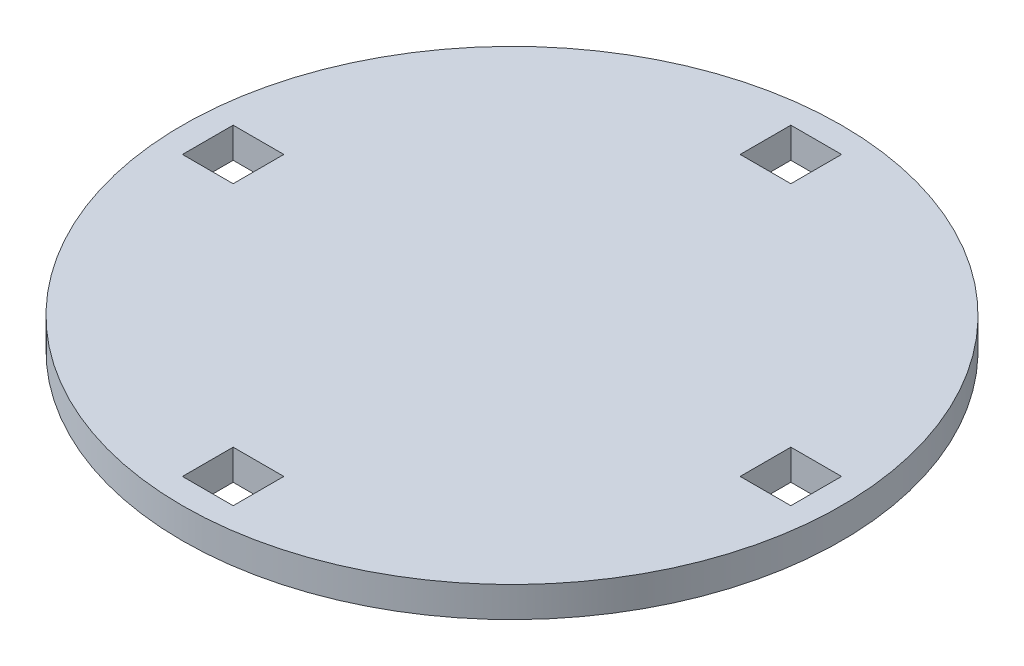
ISO-10303-21;
HEADER;
FILE_DESCRIPTION(('STEP AP214'),'2;1');
FILE_NAME('part.step','',(''),(''),'','','');
FILE_SCHEMA(('AUTOMOTIVE_DESIGN { 1 0 10303 214 1 1 1 1 }'));
ENDSEC;
DATA;
#1=APPLICATION_CONTEXT('core data for automotive mechanical design processes');
#2=APPLICATION_PROTOCOL_DEFINITION('international standard','automotive_design',2000,#1);
#3=PRODUCT_CONTEXT('',#1,'mechanical');
#4=PRODUCT('Part','Part','',(#3));
#5=PRODUCT_RELATED_PRODUCT_CATEGORY('part','',(#4));
#6=PRODUCT_DEFINITION_FORMATION('','',#4);
#7=PRODUCT_DEFINITION_CONTEXT('part definition',#1,'design');
#8=PRODUCT_DEFINITION('design','',#6,#7);
#9=PRODUCT_DEFINITION_SHAPE('','',#8);
#10=(LENGTH_UNIT() NAMED_UNIT(*) SI_UNIT(.MILLI.,.METRE.));
#11=(NAMED_UNIT(*) PLANE_ANGLE_UNIT() SI_UNIT($,.RADIAN.));
#12=(NAMED_UNIT(*) SI_UNIT($,.STERADIAN.) SOLID_ANGLE_UNIT());
#13=UNCERTAINTY_MEASURE_WITH_UNIT(LENGTH_MEASURE(1.E-05),#10,'distance_accuracy_value','');
#14=(GEOMETRIC_REPRESENTATION_CONTEXT(3) GLOBAL_UNCERTAINTY_ASSIGNED_CONTEXT((#13)) GLOBAL_UNIT_ASSIGNED_CONTEXT((#10,
#11,#12)) REPRESENTATION_CONTEXT('',''));
#15=CARTESIAN_POINT('',(0.,0.,0.));
#16=DIRECTION('',(0.,0.,1.));
#17=DIRECTION('',(1.,0.,0.));
#18=AXIS2_PLACEMENT_3D('',#15,#16,#17);
#19=CARTESIAN_POINT('',(0.,3.,0.));
#20=DIRECTION('',(0.,-1.,0.));
#21=DIRECTION('',(0.,0.,-1.));
#22=AXIS2_PLACEMENT_3D('',#19,#20,#21);
#23=CYLINDRICAL_SURFACE('',#22,32.5);
#24=CARTESIAN_POINT('',(0.,3.,0.));
#25=DIRECTION('',(0.,1.,0.));
#26=DIRECTION('',(0.,0.,1.));
#27=AXIS2_PLACEMENT_3D('',#24,#25,#26);
#28=CIRCLE('',#27,32.5);
#29=CARTESIAN_POINT('',(0.,3.,32.5));
#30=VERTEX_POINT('',#29);
#31=EDGE_CURVE('E220',#30,#30,#28,.T.);
#32=ORIENTED_EDGE('',*,*,#31,.F.);
#33=EDGE_LOOP('',(#32));
#34=FACE_BOUND('',#33,.T.);
#35=CARTESIAN_POINT('',(0.,0.,0.));
#36=DIRECTION('',(0.,1.,0.));
#37=DIRECTION('',(0.,0.,1.));
#38=AXIS2_PLACEMENT_3D('',#35,#36,#37);
#39=CIRCLE('',#38,32.5);
#40=CARTESIAN_POINT('',(0.,0.,32.5));
#41=VERTEX_POINT('',#40);
#42=EDGE_CURVE('E219',#41,#41,#39,.T.);
#43=ORIENTED_EDGE('',*,*,#42,.T.);
#44=EDGE_LOOP('',(#43));
#45=FACE_BOUND('',#44,.T.);
#46=ADVANCED_FACE('F50',(#34,#45),#23,.T.);
#47=CARTESIAN_POINT('',(0.,3.,0.));
#48=DIRECTION('',(0.,1.,0.));
#49=DIRECTION('',(0.,0.,1.));
#50=AXIS2_PLACEMENT_3D('',#47,#48,#49);
#51=PLANE('',#50);
#52=DIRECTION('',(0.,0.,-1.));
#53=VECTOR('',#52,1.);
#54=CARTESIAN_POINT('',(30.,3.,0.));
#55=LINE('',#54,#53);
#56=CARTESIAN_POINT('',(30.,3.,2.5));
#57=VERTEX_POINT('',#56);
#58=CARTESIAN_POINT('',(30.,3.,-2.5));
#59=VERTEX_POINT('',#58);
#60=EDGE_CURVE('E217',#57,#59,#55,.T.);
#61=ORIENTED_EDGE('',*,*,#60,.F.);
#62=DIRECTION('',(1.,0.,0.));
#63=VECTOR('',#62,1.);
#64=CARTESIAN_POINT('',(0.,3.,2.5));
#65=LINE('',#64,#63);
#66=CARTESIAN_POINT('',(25.,3.,2.5));
#67=VERTEX_POINT('',#66);
#68=EDGE_CURVE('E215',#67,#57,#65,.T.);
#69=ORIENTED_EDGE('',*,*,#68,.F.);
#70=DIRECTION('',(0.,0.,1.));
#71=VECTOR('',#70,1.);
#72=CARTESIAN_POINT('',(25.,3.,0.));
#73=LINE('',#72,#71);
#74=CARTESIAN_POINT('',(25.,3.,-2.5));
#75=VERTEX_POINT('',#74);
#76=EDGE_CURVE('E213',#75,#67,#73,.T.);
#77=ORIENTED_EDGE('',*,*,#76,.F.);
#78=DIRECTION('',(-1.,0.,0.));
#79=VECTOR('',#78,1.);
#80=CARTESIAN_POINT('',(0.,3.,-2.5));
#81=LINE('',#80,#79);
#82=EDGE_CURVE('E211',#59,#75,#81,.T.);
#83=ORIENTED_EDGE('',*,*,#82,.F.);
#84=EDGE_LOOP('',(#61,#69,#77,#83));
#85=FACE_BOUND('',#84,.T.);
#86=DIRECTION('',(0.,0.,1.));
#87=VECTOR('',#86,1.);
#88=CARTESIAN_POINT('',(-2.5,3.,0.));
#89=LINE('',#88,#87);
#90=CARTESIAN_POINT('',(-2.5,3.,25.));
#91=VERTEX_POINT('',#90);
#92=CARTESIAN_POINT('',(-2.5,3.,30.));
#93=VERTEX_POINT('',#92);
#94=EDGE_CURVE('E209',#91,#93,#89,.T.);
#95=ORIENTED_EDGE('',*,*,#94,.F.);
#96=DIRECTION('',(-1.,0.,0.));
#97=VECTOR('',#96,1.);
#98=CARTESIAN_POINT('',(0.,3.,25.));
#99=LINE('',#98,#97);
#100=CARTESIAN_POINT('',(2.5,3.,25.));
#101=VERTEX_POINT('',#100);
#102=EDGE_CURVE('E207',#101,#91,#99,.T.);
#103=ORIENTED_EDGE('',*,*,#102,.F.);
#104=DIRECTION('',(0.,0.,-1.));
#105=VECTOR('',#104,1.);
#106=CARTESIAN_POINT('',(2.5,3.,0.));
#107=LINE('',#106,#105);
#108=CARTESIAN_POINT('',(2.5,3.,30.));
#109=VERTEX_POINT('',#108);
#110=EDGE_CURVE('E205',#109,#101,#107,.T.);
#111=ORIENTED_EDGE('',*,*,#110,.F.);
#112=DIRECTION('',(1.,0.,0.));
#113=VECTOR('',#112,1.);
#114=CARTESIAN_POINT('',(0.,3.,30.));
#115=LINE('',#114,#113);
#116=EDGE_CURVE('E203',#93,#109,#115,.T.);
#117=ORIENTED_EDGE('',*,*,#116,.F.);
#118=EDGE_LOOP('',(#95,#103,#111,#117));
#119=FACE_BOUND('',#118,.T.);
#120=DIRECTION('',(-1.,0.,0.));
#121=VECTOR('',#120,1.);
#122=CARTESIAN_POINT('',(0.,3.,-2.5));
#123=LINE('',#122,#121);
#124=CARTESIAN_POINT('',(-25.,3.,-2.5));
#125=VERTEX_POINT('',#124);
#126=CARTESIAN_POINT('',(-30.,3.,-2.49999999999999));
#127=VERTEX_POINT('',#126);
#128=EDGE_CURVE('E200',#125,#127,#123,.T.);
#129=ORIENTED_EDGE('',*,*,#128,.F.);
#130=DIRECTION('',(0.,0.,-1.));
#131=VECTOR('',#130,1.);
#132=CARTESIAN_POINT('',(-25.,3.,0.));
#133=LINE('',#132,#131);
#134=CARTESIAN_POINT('',(-25.,3.,2.5));
#135=VERTEX_POINT('',#134);
#136=EDGE_CURVE('E198',#135,#125,#133,.T.);
#137=ORIENTED_EDGE('',*,*,#136,.F.);
#138=DIRECTION('',(1.,0.,0.));
#139=VECTOR('',#138,1.);
#140=CARTESIAN_POINT('',(0.,3.,2.5));
#141=LINE('',#140,#139);
#142=CARTESIAN_POINT('',(-30.,3.,2.50000000000001));
#143=VERTEX_POINT('',#142);
#144=EDGE_CURVE('E196',#143,#135,#141,.T.);
#145=ORIENTED_EDGE('',*,*,#144,.F.);
#146=DIRECTION('',(0.,0.,1.));
#147=VECTOR('',#146,1.);
#148=CARTESIAN_POINT('',(-30.,3.,0.));
#149=LINE('',#148,#147);
#150=EDGE_CURVE('E194',#127,#143,#149,.T.);
#151=ORIENTED_EDGE('',*,*,#150,.F.);
#152=EDGE_LOOP('',(#129,#137,#145,#151));
#153=FACE_BOUND('',#152,.T.);
#154=DIRECTION('',(0.,0.,-1.));
#155=VECTOR('',#154,1.);
#156=CARTESIAN_POINT('',(2.5,3.,0.));
#157=LINE('',#156,#155);
#158=CARTESIAN_POINT('',(2.49999999999999,3.,-25.));
#159=VERTEX_POINT('',#158);
#160=CARTESIAN_POINT('',(2.49999999999999,3.,-30.));
#161=VERTEX_POINT('',#160);
#162=EDGE_CURVE('E189',#159,#161,#157,.T.);
#163=ORIENTED_EDGE('',*,*,#162,.F.);
#164=DIRECTION('',(1.,0.,0.));
#165=VECTOR('',#164,1.);
#166=CARTESIAN_POINT('',(0.,3.,-25.));
#167=LINE('',#166,#165);
#168=CARTESIAN_POINT('',(-2.50000000000001,3.,-25.));
#169=VERTEX_POINT('',#168);
#170=EDGE_CURVE('E187',#169,#159,#167,.T.);
#171=ORIENTED_EDGE('',*,*,#170,.F.);
#172=DIRECTION('',(0.,0.,1.));
#173=VECTOR('',#172,1.);
#174=CARTESIAN_POINT('',(-2.5,3.,0.));
#175=LINE('',#174,#173);
#176=CARTESIAN_POINT('',(-2.50000000000001,3.,-30.));
#177=VERTEX_POINT('',#176);
#178=EDGE_CURVE('E172',#177,#169,#175,.T.);
#179=ORIENTED_EDGE('',*,*,#178,.F.);
#180=DIRECTION('',(-1.,0.,0.));
#181=VECTOR('',#180,1.);
#182=CARTESIAN_POINT('',(0.,3.,-30.));
#183=LINE('',#182,#181);
#184=EDGE_CURVE('E161',#161,#177,#183,.T.);
#185=ORIENTED_EDGE('',*,*,#184,.F.);
#186=EDGE_LOOP('',(#163,#171,#179,#185));
#187=FACE_BOUND('',#186,.T.);
#188=ORIENTED_EDGE('',*,*,#31,.T.);
#189=EDGE_LOOP('',(#188));
#190=FACE_BOUND('',#189,.T.);
#191=ADVANCED_FACE('F185',(#85,#119,#153,#187,#190),#51,.T.);
#192=CARTESIAN_POINT('',(0.,0.,0.));
#193=DIRECTION('',(0.,1.,0.));
#194=DIRECTION('',(0.,0.,1.));
#195=AXIS2_PLACEMENT_3D('',#192,#193,#194);
#196=PLANE('',#195);
#197=DIRECTION('',(1.,0.,0.));
#198=VECTOR('',#197,1.);
#199=CARTESIAN_POINT('',(0.,0.,2.5));
#200=LINE('',#199,#198);
#201=CARTESIAN_POINT('',(25.,0.,2.5));
#202=VERTEX_POINT('',#201);
#203=CARTESIAN_POINT('',(30.,0.,2.5));
#204=VERTEX_POINT('',#203);
#205=EDGE_CURVE('E57',#202,#204,#200,.T.);
#206=ORIENTED_EDGE('',*,*,#205,.T.);
#207=DIRECTION('',(0.,0.,-1.));
#208=VECTOR('',#207,1.);
#209=CARTESIAN_POINT('',(30.,0.,0.));
#210=LINE('',#209,#208);
#211=CARTESIAN_POINT('',(30.,0.,-2.5));
#212=VERTEX_POINT('',#211);
#213=EDGE_CURVE('E13',#204,#212,#210,.T.);
#214=ORIENTED_EDGE('',*,*,#213,.T.);
#215=DIRECTION('',(-1.,0.,0.));
#216=VECTOR('',#215,1.);
#217=CARTESIAN_POINT('',(0.,0.,-2.5));
#218=LINE('',#217,#216);
#219=CARTESIAN_POINT('',(25.,0.,-2.5));
#220=VERTEX_POINT('',#219);
#221=EDGE_CURVE('E258',#212,#220,#218,.T.);
#222=ORIENTED_EDGE('',*,*,#221,.T.);
#223=DIRECTION('',(0.,0.,1.));
#224=VECTOR('',#223,1.);
#225=CARTESIAN_POINT('',(25.,0.,0.));
#226=LINE('',#225,#224);
#227=EDGE_CURVE('E261',#220,#202,#226,.T.);
#228=ORIENTED_EDGE('',*,*,#227,.T.);
#229=EDGE_LOOP('',(#206,#214,#222,#228));
#230=FACE_BOUND('',#229,.T.);
#231=DIRECTION('',(-1.,0.,0.));
#232=VECTOR('',#231,1.);
#233=CARTESIAN_POINT('',(0.,0.,25.));
#234=LINE('',#233,#232);
#235=CARTESIAN_POINT('',(2.5,0.,25.));
#236=VERTEX_POINT('',#235);
#237=CARTESIAN_POINT('',(-2.5,0.,25.));
#238=VERTEX_POINT('',#237);
#239=EDGE_CURVE('E252',#236,#238,#234,.T.);
#240=ORIENTED_EDGE('',*,*,#239,.T.);
#241=DIRECTION('',(0.,0.,1.));
#242=VECTOR('',#241,1.);
#243=CARTESIAN_POINT('',(-2.5,0.,0.));
#244=LINE('',#243,#242);
#245=CARTESIAN_POINT('',(-2.5,0.,30.));
#246=VERTEX_POINT('',#245);
#247=EDGE_CURVE('E255',#238,#246,#244,.T.);
#248=ORIENTED_EDGE('',*,*,#247,.T.);
#249=DIRECTION('',(1.,0.,0.));
#250=VECTOR('',#249,1.);
#251=CARTESIAN_POINT('',(0.,0.,30.));
#252=LINE('',#251,#250);
#253=CARTESIAN_POINT('',(2.5,0.,30.));
#254=VERTEX_POINT('',#253);
#255=EDGE_CURVE('E246',#246,#254,#252,.T.);
#256=ORIENTED_EDGE('',*,*,#255,.T.);
#257=DIRECTION('',(0.,0.,-1.));
#258=VECTOR('',#257,1.);
#259=CARTESIAN_POINT('',(2.5,0.,0.));
#260=LINE('',#259,#258);
#261=EDGE_CURVE('E249',#254,#236,#260,.T.);
#262=ORIENTED_EDGE('',*,*,#261,.T.);
#263=EDGE_LOOP('',(#240,#248,#256,#262));
#264=FACE_BOUND('',#263,.T.);
#265=DIRECTION('',(0.,0.,-1.));
#266=VECTOR('',#265,1.);
#267=CARTESIAN_POINT('',(-25.,0.,0.));
#268=LINE('',#267,#266);
#269=CARTESIAN_POINT('',(-25.,0.,2.5));
#270=VERTEX_POINT('',#269);
#271=CARTESIAN_POINT('',(-25.,0.,-2.5));
#272=VERTEX_POINT('',#271);
#273=EDGE_CURVE('E240',#270,#272,#268,.T.);
#274=ORIENTED_EDGE('',*,*,#273,.T.);
#275=DIRECTION('',(-1.,0.,0.));
#276=VECTOR('',#275,1.);
#277=CARTESIAN_POINT('',(0.,0.,-2.5));
#278=LINE('',#277,#276);
#279=CARTESIAN_POINT('',(-30.,0.,-2.49999999999999));
#280=VERTEX_POINT('',#279);
#281=EDGE_CURVE('E243',#272,#280,#278,.T.);
#282=ORIENTED_EDGE('',*,*,#281,.T.);
#283=DIRECTION('',(0.,0.,1.));
#284=VECTOR('',#283,1.);
#285=CARTESIAN_POINT('',(-30.,0.,0.));
#286=LINE('',#285,#284);
#287=CARTESIAN_POINT('',(-30.,0.,2.50000000000001));
#288=VERTEX_POINT('',#287);
#289=EDGE_CURVE('E234',#280,#288,#286,.T.);
#290=ORIENTED_EDGE('',*,*,#289,.T.);
#291=DIRECTION('',(1.,0.,0.));
#292=VECTOR('',#291,1.);
#293=CARTESIAN_POINT('',(0.,0.,2.5));
#294=LINE('',#293,#292);
#295=EDGE_CURVE('E237',#288,#270,#294,.T.);
#296=ORIENTED_EDGE('',*,*,#295,.T.);
#297=EDGE_LOOP('',(#274,#282,#290,#296));
#298=FACE_BOUND('',#297,.T.);
#299=DIRECTION('',(1.,0.,0.));
#300=VECTOR('',#299,1.);
#301=CARTESIAN_POINT('',(0.,0.,-25.));
#302=LINE('',#301,#300);
#303=CARTESIAN_POINT('',(-2.50000000000001,0.,-25.));
#304=VERTEX_POINT('',#303);
#305=CARTESIAN_POINT('',(2.49999999999999,0.,-25.));
#306=VERTEX_POINT('',#305);
#307=EDGE_CURVE('E228',#304,#306,#302,.T.);
#308=ORIENTED_EDGE('',*,*,#307,.T.);
#309=DIRECTION('',(0.,0.,-1.));
#310=VECTOR('',#309,1.);
#311=CARTESIAN_POINT('',(2.5,0.,0.));
#312=LINE('',#311,#310);
#313=CARTESIAN_POINT('',(2.49999999999999,0.,-30.));
#314=VERTEX_POINT('',#313);
#315=EDGE_CURVE('E231',#306,#314,#312,.T.);
#316=ORIENTED_EDGE('',*,*,#315,.T.);
#317=DIRECTION('',(-1.,0.,0.));
#318=VECTOR('',#317,1.);
#319=CARTESIAN_POINT('',(0.,0.,-30.));
#320=LINE('',#319,#318);
#321=CARTESIAN_POINT('',(-2.50000000000001,0.,-30.));
#322=VERTEX_POINT('',#321);
#323=EDGE_CURVE('E223',#314,#322,#320,.T.);
#324=ORIENTED_EDGE('',*,*,#323,.T.);
#325=DIRECTION('',(0.,0.,1.));
#326=VECTOR('',#325,1.);
#327=CARTESIAN_POINT('',(-2.5,0.,0.));
#328=LINE('',#327,#326);
#329=EDGE_CURVE('E180',#322,#304,#328,.T.);
#330=ORIENTED_EDGE('',*,*,#329,.T.);
#331=EDGE_LOOP('',(#308,#316,#324,#330));
#332=FACE_BOUND('',#331,.T.);
#333=ORIENTED_EDGE('',*,*,#42,.F.);
#334=EDGE_LOOP('',(#333));
#335=FACE_BOUND('',#334,.T.);
#336=ADVANCED_FACE('F265',(#230,#264,#298,#332,#335),#196,.F.);
#337=CARTESIAN_POINT('',(2.49999999999999,-1.2E-05,-25.));
#338=DIRECTION('',(1.,0.,0.));
#339=DIRECTION('',(0.,0.,-1.));
#340=AXIS2_PLACEMENT_3D('',#337,#338,#339);
#341=PLANE('',#340);
#342=ORIENTED_EDGE('',*,*,#162,.T.);
#343=DIRECTION('',(0.,1.,0.));
#344=VECTOR('',#343,1.);
#345=CARTESIAN_POINT('',(2.49999999999999,-1.2E-05,-30.));
#346=LINE('',#345,#344);
#347=EDGE_CURVE('E167',#314,#161,#346,.T.);
#348=ORIENTED_EDGE('',*,*,#347,.F.);
#349=ORIENTED_EDGE('',*,*,#315,.F.);
#350=DIRECTION('',(0.,1.,0.));
#351=VECTOR('',#350,1.);
#352=CARTESIAN_POINT('',(2.49999999999999,-1.2E-05,-25.));
#353=LINE('',#352,#351);
#354=EDGE_CURVE('E307',#306,#159,#353,.T.);
#355=ORIENTED_EDGE('',*,*,#354,.T.);
#356=EDGE_LOOP('',(#342,#348,#349,#355));
#357=FACE_BOUND('',#356,.T.);
#358=ADVANCED_FACE('F316',(#357),#341,.F.);
#359=CARTESIAN_POINT('',(-2.50000000000001,-1.2E-05,-25.));
#360=DIRECTION('',(0.,0.,1.));
#361=DIRECTION('',(1.,0.,0.));
#362=AXIS2_PLACEMENT_3D('',#359,#360,#361);
#363=PLANE('',#362);
#364=ORIENTED_EDGE('',*,*,#170,.T.);
#365=ORIENTED_EDGE('',*,*,#354,.F.);
#366=ORIENTED_EDGE('',*,*,#307,.F.);
#367=DIRECTION('',(0.,1.,0.));
#368=VECTOR('',#367,1.);
#369=CARTESIAN_POINT('',(-2.50000000000001,-1.2E-05,-25.));
#370=LINE('',#369,#368);
#371=EDGE_CURVE('E182',#304,#169,#370,.T.);
#372=ORIENTED_EDGE('',*,*,#371,.T.);
#373=EDGE_LOOP('',(#364,#365,#366,#372));
#374=FACE_BOUND('',#373,.T.);
#375=ADVANCED_FACE('F311',(#374),#363,.F.);
#376=CARTESIAN_POINT('',(-2.50000000000001,-1.2E-05,-25.));
#377=DIRECTION('',(-1.,0.,0.));
#378=DIRECTION('',(0.,0.,1.));
#379=AXIS2_PLACEMENT_3D('',#376,#377,#378);
#380=PLANE('',#379);
#381=ORIENTED_EDGE('',*,*,#178,.T.);
#382=ORIENTED_EDGE('',*,*,#371,.F.);
#383=ORIENTED_EDGE('',*,*,#329,.F.);
#384=DIRECTION('',(0.,1.,0.));
#385=VECTOR('',#384,1.);
#386=CARTESIAN_POINT('',(-2.50000000000001,-1.2E-05,-30.));
#387=LINE('',#386,#385);
#388=EDGE_CURVE('E164',#322,#177,#387,.T.);
#389=ORIENTED_EDGE('',*,*,#388,.T.);
#390=EDGE_LOOP('',(#381,#382,#383,#389));
#391=FACE_BOUND('',#390,.T.);
#392=ADVANCED_FACE('F176',(#391),#380,.F.);
#393=CARTESIAN_POINT('',(-2.50000000000001,-1.2E-05,-30.));
#394=DIRECTION('',(0.,0.,-1.));
#395=DIRECTION('',(-1.,0.,0.));
#396=AXIS2_PLACEMENT_3D('',#393,#394,#395);
#397=PLANE('',#396);
#398=ORIENTED_EDGE('',*,*,#184,.T.);
#399=ORIENTED_EDGE('',*,*,#388,.F.);
#400=ORIENTED_EDGE('',*,*,#323,.F.);
#401=ORIENTED_EDGE('',*,*,#347,.T.);
#402=EDGE_LOOP('',(#398,#399,#400,#401));
#403=FACE_BOUND('',#402,.T.);
#404=ADVANCED_FACE('F163',(#403),#397,.F.);
#405=CARTESIAN_POINT('',(-25.,-1.2E-05,-2.5));
#406=DIRECTION('',(0.,0.,-1.));
#407=DIRECTION('',(-1.,0.,0.));
#408=AXIS2_PLACEMENT_3D('',#405,#406,#407);
#409=PLANE('',#408);
#410=ORIENTED_EDGE('',*,*,#128,.T.);
#411=DIRECTION('',(0.,1.,0.));
#412=VECTOR('',#411,1.);
#413=CARTESIAN_POINT('',(-30.,-1.2E-05,-2.49999999999999));
#414=LINE('',#413,#412);
#415=EDGE_CURVE('E305',#280,#127,#414,.T.);
#416=ORIENTED_EDGE('',*,*,#415,.F.);
#417=ORIENTED_EDGE('',*,*,#281,.F.);
#418=DIRECTION('',(0.,1.,0.));
#419=VECTOR('',#418,1.);
#420=CARTESIAN_POINT('',(-25.,-1.2E-05,-2.5));
#421=LINE('',#420,#419);
#422=EDGE_CURVE('E296',#272,#125,#421,.T.);
#423=ORIENTED_EDGE('',*,*,#422,.T.);
#424=EDGE_LOOP('',(#410,#416,#417,#423));
#425=FACE_BOUND('',#424,.T.);
#426=ADVANCED_FACE('F350',(#425),#409,.F.);
#427=CARTESIAN_POINT('',(-25.,-1.2E-05,2.5));
#428=DIRECTION('',(1.,0.,0.));
#429=DIRECTION('',(0.,0.,-1.));
#430=AXIS2_PLACEMENT_3D('',#427,#428,#429);
#431=PLANE('',#430);
#432=ORIENTED_EDGE('',*,*,#136,.T.);
#433=ORIENTED_EDGE('',*,*,#422,.F.);
#434=ORIENTED_EDGE('',*,*,#273,.F.);
#435=DIRECTION('',(0.,1.,0.));
#436=VECTOR('',#435,1.);
#437=CARTESIAN_POINT('',(-25.,-1.2E-05,2.5));
#438=LINE('',#437,#436);
#439=EDGE_CURVE('E299',#270,#135,#438,.T.);
#440=ORIENTED_EDGE('',*,*,#439,.T.);
#441=EDGE_LOOP('',(#432,#433,#434,#440));
#442=FACE_BOUND('',#441,.T.);
#443=ADVANCED_FACE('F353',(#442),#431,.F.);
#444=CARTESIAN_POINT('',(-25.,-1.2E-05,2.5));
#445=DIRECTION('',(0.,0.,1.));
#446=DIRECTION('',(1.,0.,0.));
#447=AXIS2_PLACEMENT_3D('',#444,#445,#446);
#448=PLANE('',#447);
#449=ORIENTED_EDGE('',*,*,#144,.T.);
#450=ORIENTED_EDGE('',*,*,#439,.F.);
#451=ORIENTED_EDGE('',*,*,#295,.F.);
#452=DIRECTION('',(0.,1.,0.));
#453=VECTOR('',#452,1.);
#454=CARTESIAN_POINT('',(-30.,-1.2E-05,2.50000000000001));
#455=LINE('',#454,#453);
#456=EDGE_CURVE('E302',#288,#143,#455,.T.);
#457=ORIENTED_EDGE('',*,*,#456,.T.);
#458=EDGE_LOOP('',(#449,#450,#451,#457));
#459=FACE_BOUND('',#458,.T.);
#460=ADVANCED_FACE('F358',(#459),#448,.F.);
#461=CARTESIAN_POINT('',(-30.,-1.2E-05,2.50000000000001));
#462=DIRECTION('',(-1.,0.,0.));
#463=DIRECTION('',(0.,0.,1.));
#464=AXIS2_PLACEMENT_3D('',#461,#462,#463);
#465=PLANE('',#464);
#466=ORIENTED_EDGE('',*,*,#150,.T.);
#467=ORIENTED_EDGE('',*,*,#456,.F.);
#468=ORIENTED_EDGE('',*,*,#289,.F.);
#469=ORIENTED_EDGE('',*,*,#415,.T.);
#470=EDGE_LOOP('',(#466,#467,#468,#469));
#471=FACE_BOUND('',#470,.T.);
#472=ADVANCED_FACE('F360',(#471),#465,.F.);
#473=CARTESIAN_POINT('',(-2.5,-1.2E-05,25.));
#474=DIRECTION('',(-1.,0.,0.));
#475=DIRECTION('',(0.,0.,1.));
#476=AXIS2_PLACEMENT_3D('',#473,#474,#475);
#477=PLANE('',#476);
#478=ORIENTED_EDGE('',*,*,#94,.T.);
#479=DIRECTION('',(0.,1.,0.));
#480=VECTOR('',#479,1.);
#481=CARTESIAN_POINT('',(-2.5,-1.2E-05,30.));
#482=LINE('',#481,#480);
#483=EDGE_CURVE('E72',#246,#93,#482,.T.);
#484=ORIENTED_EDGE('',*,*,#483,.F.);
#485=ORIENTED_EDGE('',*,*,#247,.F.);
#486=DIRECTION('',(0.,1.,0.));
#487=VECTOR('',#486,1.);
#488=CARTESIAN_POINT('',(-2.5,-1.2E-05,25.));
#489=LINE('',#488,#487);
#490=EDGE_CURVE('E286',#238,#91,#489,.T.);
#491=ORIENTED_EDGE('',*,*,#490,.T.);
#492=EDGE_LOOP('',(#478,#484,#485,#491));
#493=FACE_BOUND('',#492,.T.);
#494=ADVANCED_FACE('F362',(#493),#477,.F.);
#495=CARTESIAN_POINT('',(2.5,-1.2E-05,25.));
#496=DIRECTION('',(0.,0.,-1.));
#497=DIRECTION('',(-1.,0.,0.));
#498=AXIS2_PLACEMENT_3D('',#495,#496,#497);
#499=PLANE('',#498);
#500=ORIENTED_EDGE('',*,*,#102,.T.);
#501=ORIENTED_EDGE('',*,*,#490,.F.);
#502=ORIENTED_EDGE('',*,*,#239,.F.);
#503=DIRECTION('',(0.,1.,0.));
#504=VECTOR('',#503,1.);
#505=CARTESIAN_POINT('',(2.5,-1.2E-05,25.));
#506=LINE('',#505,#504);
#507=EDGE_CURVE('E289',#236,#101,#506,.T.);
#508=ORIENTED_EDGE('',*,*,#507,.T.);
#509=EDGE_LOOP('',(#500,#501,#502,#508));
#510=FACE_BOUND('',#509,.T.);
#511=ADVANCED_FACE('F368',(#510),#499,.F.);
#512=CARTESIAN_POINT('',(2.5,-1.2E-05,25.));
#513=DIRECTION('',(1.,0.,0.));
#514=DIRECTION('',(0.,0.,-1.));
#515=AXIS2_PLACEMENT_3D('',#512,#513,#514);
#516=PLANE('',#515);
#517=ORIENTED_EDGE('',*,*,#110,.T.);
#518=ORIENTED_EDGE('',*,*,#507,.F.);
#519=ORIENTED_EDGE('',*,*,#261,.F.);
#520=DIRECTION('',(0.,1.,0.));
#521=VECTOR('',#520,1.);
#522=CARTESIAN_POINT('',(2.5,-1.2E-05,30.));
#523=LINE('',#522,#521);
#524=EDGE_CURVE('E292',#254,#109,#523,.T.);
#525=ORIENTED_EDGE('',*,*,#524,.T.);
#526=EDGE_LOOP('',(#517,#518,#519,#525));
#527=FACE_BOUND('',#526,.T.);
#528=ADVANCED_FACE('F414',(#527),#516,.F.);
#529=CARTESIAN_POINT('',(2.5,-1.2E-05,30.));
#530=DIRECTION('',(0.,0.,1.));
#531=DIRECTION('',(1.,0.,0.));
#532=AXIS2_PLACEMENT_3D('',#529,#530,#531);
#533=PLANE('',#532);
#534=ORIENTED_EDGE('',*,*,#116,.T.);
#535=ORIENTED_EDGE('',*,*,#524,.F.);
#536=ORIENTED_EDGE('',*,*,#255,.F.);
#537=ORIENTED_EDGE('',*,*,#483,.T.);
#538=EDGE_LOOP('',(#534,#535,#536,#537));
#539=FACE_BOUND('',#538,.T.);
#540=ADVANCED_FACE('F424',(#539),#533,.F.);
#541=CARTESIAN_POINT('',(30.,-1.2E-05,-2.5));
#542=DIRECTION('',(1.,0.,0.));
#543=DIRECTION('',(0.,0.,-1.));
#544=AXIS2_PLACEMENT_3D('',#541,#542,#543);
#545=PLANE('',#544);
#546=ORIENTED_EDGE('',*,*,#60,.T.);
#547=DIRECTION('',(0.,1.,0.));
#548=VECTOR('',#547,1.);
#549=CARTESIAN_POINT('',(30.,-1.2E-05,-2.5));
#550=LINE('',#549,#548);
#551=EDGE_CURVE('E64',#212,#59,#550,.T.);
#552=ORIENTED_EDGE('',*,*,#551,.F.);
#553=ORIENTED_EDGE('',*,*,#213,.F.);
#554=DIRECTION('',(0.,1.,0.));
#555=VECTOR('',#554,1.);
#556=CARTESIAN_POINT('',(30.,-1.2E-05,2.5));
#557=LINE('',#556,#555);
#558=EDGE_CURVE('E173',#204,#57,#557,.T.);
#559=ORIENTED_EDGE('',*,*,#558,.T.);
#560=EDGE_LOOP('',(#546,#552,#553,#559));
#561=FACE_BOUND('',#560,.T.);
#562=ADVANCED_FACE('F434',(#561),#545,.F.);
#563=CARTESIAN_POINT('',(25.,-1.2E-05,2.5));
#564=DIRECTION('',(0.,0.,1.));
#565=DIRECTION('',(1.,0.,0.));
#566=AXIS2_PLACEMENT_3D('',#563,#564,#565);
#567=PLANE('',#566);
#568=ORIENTED_EDGE('',*,*,#68,.T.);
#569=ORIENTED_EDGE('',*,*,#558,.F.);
#570=ORIENTED_EDGE('',*,*,#205,.F.);
#571=DIRECTION('',(0.,1.,0.));
#572=VECTOR('',#571,1.);
#573=CARTESIAN_POINT('',(25.,-1.2E-05,2.5));
#574=LINE('',#573,#572);
#575=EDGE_CURVE('E273',#202,#67,#574,.T.);
#576=ORIENTED_EDGE('',*,*,#575,.T.);
#577=EDGE_LOOP('',(#568,#569,#570,#576));
#578=FACE_BOUND('',#577,.T.);
#579=ADVANCED_FACE('F272',(#578),#567,.F.);
#580=CARTESIAN_POINT('',(25.,-1.2E-05,-2.5));
#581=DIRECTION('',(-1.,0.,0.));
#582=DIRECTION('',(0.,0.,1.));
#583=AXIS2_PLACEMENT_3D('',#580,#581,#582);
#584=PLANE('',#583);
#585=ORIENTED_EDGE('',*,*,#76,.T.);
#586=ORIENTED_EDGE('',*,*,#575,.F.);
#587=ORIENTED_EDGE('',*,*,#227,.F.);
#588=DIRECTION('',(0.,1.,0.));
#589=VECTOR('',#588,1.);
#590=CARTESIAN_POINT('',(25.,-1.2E-05,-2.5));
#591=LINE('',#590,#589);
#592=EDGE_CURVE('E280',#220,#75,#591,.T.);
#593=ORIENTED_EDGE('',*,*,#592,.T.);
#594=EDGE_LOOP('',(#585,#586,#587,#593));
#595=FACE_BOUND('',#594,.T.);
#596=ADVANCED_FACE('F277',(#595),#584,.F.);
#597=CARTESIAN_POINT('',(25.,-1.2E-05,-2.5));
#598=DIRECTION('',(0.,0.,-1.));
#599=DIRECTION('',(-1.,0.,0.));
#600=AXIS2_PLACEMENT_3D('',#597,#598,#599);
#601=PLANE('',#600);
#602=ORIENTED_EDGE('',*,*,#82,.T.);
#603=ORIENTED_EDGE('',*,*,#592,.F.);
#604=ORIENTED_EDGE('',*,*,#221,.F.);
#605=ORIENTED_EDGE('',*,*,#551,.T.);
#606=EDGE_LOOP('',(#602,#603,#604,#605));
#607=FACE_BOUND('',#606,.T.);
#608=ADVANCED_FACE('F460',(#607),#601,.F.);
#609=CLOSED_SHELL('',(#46,#191,#336,#358,#375,#392,#404,#426,#443,#460,#472,#494,#511,#528,#540,
#562,#579,#596,#608));
#610=MANIFOLD_SOLID_BREP('B2',#609);
#611=ADVANCED_BREP_SHAPE_REPRESENTATION('',(#18,#610),#14);
#612=SHAPE_DEFINITION_REPRESENTATION(#9,#611);
ENDSEC;
END-ISO-10303-21;
